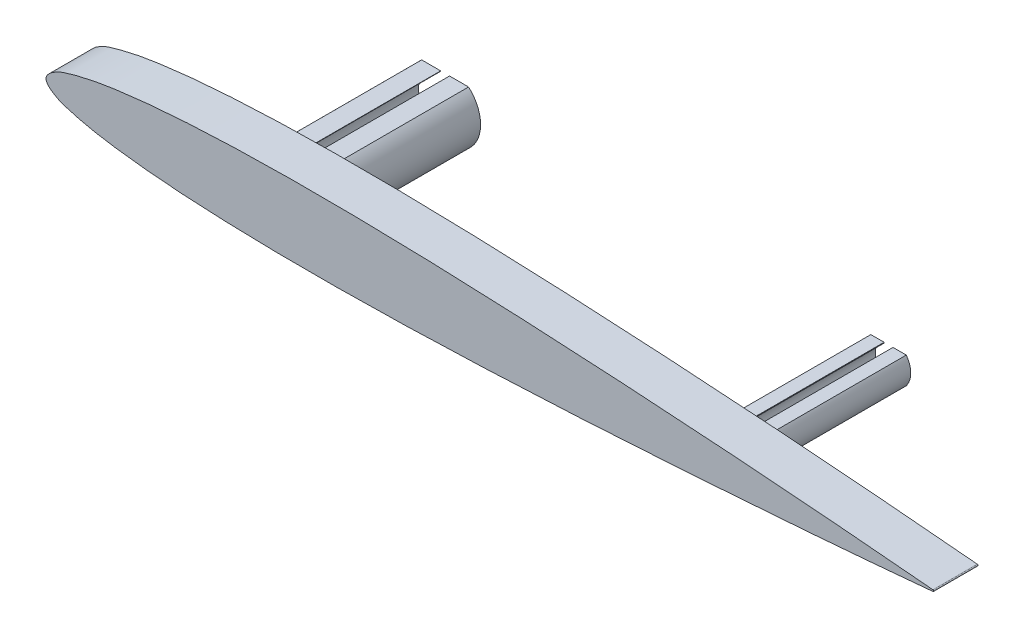
ISO-10303-21;
HEADER;
FILE_DESCRIPTION(('STEP AP214'),'2;1');
FILE_NAME('part.step','',(''),(''),'','','');
FILE_SCHEMA(('AUTOMOTIVE_DESIGN { 1 0 10303 214 1 1 1 1 }'));
ENDSEC;
DATA;
#1=APPLICATION_CONTEXT('core data for automotive mechanical design processes');
#2=APPLICATION_PROTOCOL_DEFINITION('international standard','automotive_design',2000,#1);
#3=PRODUCT_CONTEXT('',#1,'mechanical');
#4=PRODUCT('Part','Part','',(#3));
#5=PRODUCT_RELATED_PRODUCT_CATEGORY('part','',(#4));
#6=PRODUCT_DEFINITION_FORMATION('','',#4);
#7=PRODUCT_DEFINITION_CONTEXT('part definition',#1,'design');
#8=PRODUCT_DEFINITION('design','',#6,#7);
#9=PRODUCT_DEFINITION_SHAPE('','',#8);
#10=(LENGTH_UNIT() NAMED_UNIT(*) SI_UNIT(.MILLI.,.METRE.));
#11=(NAMED_UNIT(*) PLANE_ANGLE_UNIT() SI_UNIT($,.RADIAN.));
#12=(NAMED_UNIT(*) SI_UNIT($,.STERADIAN.) SOLID_ANGLE_UNIT());
#13=UNCERTAINTY_MEASURE_WITH_UNIT(LENGTH_MEASURE(1.E-05),#10,'distance_accuracy_value','');
#14=(GEOMETRIC_REPRESENTATION_CONTEXT(3) GLOBAL_UNCERTAINTY_ASSIGNED_CONTEXT((#13)) GLOBAL_UNIT_ASSIGNED_CONTEXT((#10,
#11,#12)) REPRESENTATION_CONTEXT('',''));
#15=CARTESIAN_POINT('',(0.,0.,0.));
#16=DIRECTION('',(0.,0.,1.));
#17=DIRECTION('',(1.,0.,0.));
#18=AXIS2_PLACEMENT_3D('',#15,#16,#17);
#19=CARTESIAN_POINT('',(0.,0.,0.));
#20=DIRECTION('',(0.,0.,-1.));
#21=DIRECTION('',(-1.,0.,0.));
#22=AXIS2_PLACEMENT_3D('',#19,#20,#21);
#23=PLANE('',#22);
#24=CARTESIAN_POINT('',(25.,0.,0.));
#25=DIRECTION('',(0.,0.,1.));
#26=DIRECTION('',(1.,0.,0.));
#27=AXIS2_PLACEMENT_3D('',#24,#25,#26);
#28=CIRCLE('',#27,4.);
#29=CARTESIAN_POINT('',(27.6457513110646,-3.,0.));
#30=VERTEX_POINT('',#29);
#31=CARTESIAN_POINT('',(27.6457513110646,3.,0.));
#32=VERTEX_POINT('',#31);
#33=EDGE_CURVE('E242',#30,#32,#28,.T.);
#34=ORIENTED_EDGE('',*,*,#33,.T.);
#35=DIRECTION('',(-1.,0.,0.));
#36=VECTOR('',#35,1.);
#37=CARTESIAN_POINT('',(25.5,3.,0.));
#38=LINE('',#37,#36);
#39=CARTESIAN_POINT('',(25.5,3.,0.));
#40=VERTEX_POINT('',#39);
#41=EDGE_CURVE('E211',#32,#40,#38,.T.);
#42=ORIENTED_EDGE('',*,*,#41,.T.);
#43=DIRECTION('',(0.,-1.,0.));
#44=VECTOR('',#43,1.);
#45=CARTESIAN_POINT('',(25.5,2.95803989154981,0.));
#46=LINE('',#45,#44);
#47=CARTESIAN_POINT('',(25.5,2.95803989154981,0.));
#48=VERTEX_POINT('',#47);
#49=EDGE_CURVE('E245',#40,#48,#46,.T.);
#50=ORIENTED_EDGE('',*,*,#49,.T.);
#51=CARTESIAN_POINT('',(25.,0.,0.));
#52=DIRECTION('',(0.,0.,-1.));
#53=DIRECTION('',(1.,0.,0.));
#54=AXIS2_PLACEMENT_3D('',#51,#52,#53);
#55=CIRCLE('',#54,3.);
#56=CARTESIAN_POINT('',(25.5,-2.95803989154981,0.));
#57=VERTEX_POINT('',#56);
#58=EDGE_CURVE('E247',#48,#57,#55,.T.);
#59=ORIENTED_EDGE('',*,*,#58,.T.);
#60=DIRECTION('',(0.,-1.,0.));
#61=VECTOR('',#60,1.);
#62=CARTESIAN_POINT('',(25.5,-3.,0.));
#63=LINE('',#62,#61);
#64=CARTESIAN_POINT('',(25.5,-3.,0.));
#65=VERTEX_POINT('',#64);
#66=EDGE_CURVE('E53',#57,#65,#63,.T.);
#67=ORIENTED_EDGE('',*,*,#66,.T.);
#68=DIRECTION('',(1.,0.,0.));
#69=VECTOR('',#68,1.);
#70=CARTESIAN_POINT('',(25.5,-3.,0.));
#71=LINE('',#70,#69);
#72=EDGE_CURVE('E48',#65,#30,#71,.T.);
#73=ORIENTED_EDGE('',*,*,#72,.T.);
#74=EDGE_LOOP('',(#34,#42,#50,#59,#67,#73));
#75=FACE_BOUND('',#74,.T.);
#76=CARTESIAN_POINT('',(25.,0.,0.));
#77=DIRECTION('',(0.,0.,-1.));
#78=DIRECTION('',(1.,0.,0.));
#79=AXIS2_PLACEMENT_3D('',#76,#77,#78);
#80=CIRCLE('',#79,3.);
#81=CARTESIAN_POINT('',(24.5,-2.95803989154981,0.));
#82=VERTEX_POINT('',#81);
#83=CARTESIAN_POINT('',(24.5,2.95803989154981,0.));
#84=VERTEX_POINT('',#83);
#85=EDGE_CURVE('E251',#82,#84,#80,.T.);
#86=ORIENTED_EDGE('',*,*,#85,.T.);
#87=DIRECTION('',(0.,1.,0.));
#88=VECTOR('',#87,1.);
#89=CARTESIAN_POINT('',(24.5,2.95803989154981,0.));
#90=LINE('',#89,#88);
#91=CARTESIAN_POINT('',(24.5,3.,0.));
#92=VERTEX_POINT('',#91);
#93=EDGE_CURVE('E282',#84,#92,#90,.T.);
#94=ORIENTED_EDGE('',*,*,#93,.T.);
#95=DIRECTION('',(-1.,0.,0.));
#96=VECTOR('',#95,1.);
#97=CARTESIAN_POINT('',(22.3542486889354,3.,0.));
#98=LINE('',#97,#96);
#99=CARTESIAN_POINT('',(22.3542486889354,3.,0.));
#100=VERTEX_POINT('',#99);
#101=EDGE_CURVE('E284',#92,#100,#98,.T.);
#102=ORIENTED_EDGE('',*,*,#101,.T.);
#103=CARTESIAN_POINT('',(25.,0.,0.));
#104=DIRECTION('',(0.,0.,1.));
#105=DIRECTION('',(1.,0.,0.));
#106=AXIS2_PLACEMENT_3D('',#103,#104,#105);
#107=CIRCLE('',#106,4.);
#108=CARTESIAN_POINT('',(22.3542486889354,-3.,0.));
#109=VERTEX_POINT('',#108);
#110=EDGE_CURVE('E286',#100,#109,#107,.T.);
#111=ORIENTED_EDGE('',*,*,#110,.T.);
#112=DIRECTION('',(1.,0.,0.));
#113=VECTOR('',#112,1.);
#114=CARTESIAN_POINT('',(22.3542486889354,-3.,0.));
#115=LINE('',#114,#113);
#116=CARTESIAN_POINT('',(24.5,-3.,0.));
#117=VERTEX_POINT('',#116);
#118=EDGE_CURVE('E288',#109,#117,#115,.T.);
#119=ORIENTED_EDGE('',*,*,#118,.T.);
#120=DIRECTION('',(0.,1.,0.));
#121=VECTOR('',#120,1.);
#122=CARTESIAN_POINT('',(24.5,-3.,0.));
#123=LINE('',#122,#121);
#124=EDGE_CURVE('E265',#117,#82,#123,.T.);
#125=ORIENTED_EDGE('',*,*,#124,.T.);
#126=EDGE_LOOP('',(#86,#94,#102,#111,#119,#125));
#127=FACE_BOUND('',#126,.T.);
#128=CARTESIAN_POINT('',(100.,0.084,0.));
#129=CARTESIAN_POINT('',(98.333488814933,0.236746480055364,0.));
#130=CARTESIAN_POINT('',(95.0011947254255,0.542172688557606,0.));
#131=CARTESIAN_POINT('',(88.3355596211879,1.11089898015662,0.));
#132=CARTESIAN_POINT('',(80.0032933562199,1.76361099520967,0.));
#133=CARTESIAN_POINT('',(70.0029989334555,2.45786169254404,0.));
#134=CARTESIAN_POINT('',(60.0031046254057,3.06174772348002,0.));
#135=CARTESIAN_POINT('',(50.0030086005351,3.55213921170033,0.));
#136=CARTESIAN_POINT('',(40.0025985576922,3.90294649372571,0.));
#137=CARTESIAN_POINT('',(31.666961485844,4.02526015065941,0.));
#138=CARTESIAN_POINT('',(24.9991546003269,3.97693379087482,0.));
#139=CARTESIAN_POINT('',(19.9977755867835,3.84497639830756,0.));
#140=CARTESIAN_POINT('',(14.9933631314586,3.59248695861782,0.));
#141=CARTESIAN_POINT('',(10.8271840648808,3.23765157891607,0.));
#142=CARTESIAN_POINT('',(7.48905438800269,2.81402136675529,0.));
#143=CARTESIAN_POINT('',(4.99359465012965,2.40367305928858,0.));
#144=CARTESIAN_POINT('',(2.84962633983361,1.86792549429032,0.));
#145=CARTESIAN_POINT('',(1.16541350274339,1.32098725183071,0.));
#146=CARTESIAN_POINT('',(-0.664613784127027,0.,0.));
#147=CARTESIAN_POINT('',(1.16541350274339,-1.32098725183071,0.));
#148=CARTESIAN_POINT('',(2.84962633983362,-1.86792549429032,0.));
#149=CARTESIAN_POINT('',(4.99359465012963,-2.40367305928857,0.));
#150=CARTESIAN_POINT('',(7.48905438800269,-2.81402136675529,0.));
#151=CARTESIAN_POINT('',(10.8271840648809,-3.23765157891607,0.));
#152=CARTESIAN_POINT('',(14.9933631314586,-3.59248695861782,0.));
#153=CARTESIAN_POINT('',(19.9977755867835,-3.84497639830756,0.));
#154=CARTESIAN_POINT('',(24.9991546003269,-3.97693379087482,0.));
#155=CARTESIAN_POINT('',(31.666961485844,-4.02526015065941,0.));
#156=CARTESIAN_POINT('',(40.0025985576922,-3.90294649372571,0.));
#157=CARTESIAN_POINT('',(50.0030086005351,-3.55213921170033,0.));
#158=CARTESIAN_POINT('',(60.0031046254058,-3.06174772348002,0.));
#159=CARTESIAN_POINT('',(70.0029989334555,-2.45786169254404,0.));
#160=CARTESIAN_POINT('',(80.0032933562199,-1.76361099520967,0.));
#161=CARTESIAN_POINT('',(88.3355596211879,-1.11089898015662,0.));
#162=CARTESIAN_POINT('',(95.0011947254255,-0.542172688557605,0.));
#163=CARTESIAN_POINT('',(98.333488814933,-0.236746480055364,0.));
#164=CARTESIAN_POINT('',(100.,-0.084,0.));
#165=B_SPLINE_CURVE_WITH_KNOTS('',3,(#128,#129,#130,#131,#132,#133,#134,#135,#136,#137,#138,
#139,#140,#141,#142,#143,#144,#145,#146,#147,#148,#149,#150,#151,#152,#153,#154,#155,#156,#157,
#158,#159,#160,#161,#162,#163,#164),.UNSPECIFIED.,.F.,.F.,(4,1,1,1,1,1,1,1,1,1,1,1,1,1,1,1,1,1,
1,1,1,1,1,1,1,1,1,1,1,1,1,1,1,1,4),(0.,0.0248762929189861,0.0497417146704998,0.0994434021110951,
0.149112224036195,0.198750974066913,0.248359097492202,0.297937369716024,0.347491327096237,
0.37226694027957,0.39705092368842,0.421859474838904,0.446731345826762,0.459220451479859,
0.471790601601357,0.484560454432956,0.491195112481227,0.5,0.508804887518773,0.515439545567044,
0.528209398398643,0.540779548520141,0.553268654173238,0.578140525161096,0.60294907631158,
0.62773305972043,0.652508672903763,0.702062630283976,0.751640902507798,0.801249025933086,
0.850887775963805,0.900556597888905,0.9502582853295,0.975123707081014,1.),.UNSPECIFIED.);
#166=CARTESIAN_POINT('',(100.,0.084,0.));
#167=VERTEX_POINT('',#166);
#168=CARTESIAN_POINT('',(100.,-0.084,0.));
#169=VERTEX_POINT('',#168);
#170=EDGE_CURVE('E393',#167,#169,#165,.T.);
#171=ORIENTED_EDGE('',*,*,#170,.F.);
#172=CARTESIAN_POINT('',(100.,0.,0.));
#173=DIRECTION('',(0.,0.,1.));
#174=DIRECTION('',(-1.,0.,0.));
#175=AXIS2_PLACEMENT_3D('',#172,#173,#174);
#176=CIRCLE('',#175,0.084);
#177=EDGE_CURVE('E401',#169,#167,#176,.T.);
#178=ORIENTED_EDGE('',*,*,#177,.F.);
#179=EDGE_LOOP('',(#171,#178));
#180=FACE_BOUND('',#179,.T.);
#181=DIRECTION('',(0.,-1.,0.));
#182=VECTOR('',#181,1.);
#183=CARTESIAN_POINT('',(74.5,-1.41421356237309,0.));
#184=LINE('',#183,#182);
#185=CARTESIAN_POINT('',(74.5,-1.41421356237309,0.));
#186=VERTEX_POINT('',#185);
#187=CARTESIAN_POINT('',(74.5,-1.5,0.));
#188=VERTEX_POINT('',#187);
#189=EDGE_CURVE('E369',#186,#188,#184,.T.);
#190=ORIENTED_EDGE('',*,*,#189,.F.);
#191=CARTESIAN_POINT('',(75.,0.,0.));
#192=DIRECTION('',(0.,0.,1.));
#193=DIRECTION('',(-1.,0.,0.));
#194=AXIS2_PLACEMENT_3D('',#191,#192,#193);
#195=CIRCLE('',#194,1.5);
#196=CARTESIAN_POINT('',(74.5,1.41421356237309,0.));
#197=VERTEX_POINT('',#196);
#198=EDGE_CURVE('E351',#197,#186,#195,.T.);
#199=ORIENTED_EDGE('',*,*,#198,.F.);
#200=DIRECTION('',(0.,-1.,0.));
#201=VECTOR('',#200,1.);
#202=CARTESIAN_POINT('',(74.5,1.5,0.));
#203=LINE('',#202,#201);
#204=CARTESIAN_POINT('',(74.5,1.5,0.));
#205=VERTEX_POINT('',#204);
#206=EDGE_CURVE('E356',#205,#197,#203,.T.);
#207=ORIENTED_EDGE('',*,*,#206,.F.);
#208=DIRECTION('',(1.,0.,0.));
#209=VECTOR('',#208,1.);
#210=CARTESIAN_POINT('',(74.5,1.5,0.));
#211=LINE('',#210,#209);
#212=CARTESIAN_POINT('',(73.,1.5,0.));
#213=VERTEX_POINT('',#212);
#214=EDGE_CURVE('E375',#213,#205,#211,.T.);
#215=ORIENTED_EDGE('',*,*,#214,.F.);
#216=CARTESIAN_POINT('',(75.,0.,0.));
#217=DIRECTION('',(0.,0.,-1.));
#218=DIRECTION('',(-1.,0.,0.));
#219=AXIS2_PLACEMENT_3D('',#216,#217,#218);
#220=CIRCLE('',#219,2.5);
#221=CARTESIAN_POINT('',(73.,-1.5,0.));
#222=VERTEX_POINT('',#221);
#223=EDGE_CURVE('E373',#222,#213,#220,.T.);
#224=ORIENTED_EDGE('',*,*,#223,.F.);
#225=DIRECTION('',(-1.,0.,0.));
#226=VECTOR('',#225,1.);
#227=CARTESIAN_POINT('',(74.5,-1.5,0.));
#228=LINE('',#227,#226);
#229=EDGE_CURVE('E371',#188,#222,#228,.T.);
#230=ORIENTED_EDGE('',*,*,#229,.F.);
#231=EDGE_LOOP('',(#190,#199,#207,#215,#224,#230));
#232=FACE_BOUND('',#231,.T.);
#233=DIRECTION('',(1.,0.,0.));
#234=VECTOR('',#233,1.);
#235=CARTESIAN_POINT('',(77.,1.5,0.));
#236=LINE('',#235,#234);
#237=CARTESIAN_POINT('',(75.5,1.5,0.));
#238=VERTEX_POINT('',#237);
#239=CARTESIAN_POINT('',(77.,1.5,0.));
#240=VERTEX_POINT('',#239);
#241=EDGE_CURVE('E326',#238,#240,#236,.T.);
#242=ORIENTED_EDGE('',*,*,#241,.F.);
#243=DIRECTION('',(0.,1.,0.));
#244=VECTOR('',#243,1.);
#245=CARTESIAN_POINT('',(75.5,1.5,0.));
#246=LINE('',#245,#244);
#247=CARTESIAN_POINT('',(75.5,1.41421356237309,0.));
#248=VERTEX_POINT('',#247);
#249=EDGE_CURVE('E294',#248,#238,#246,.T.);
#250=ORIENTED_EDGE('',*,*,#249,.F.);
#251=CARTESIAN_POINT('',(75.,0.,0.));
#252=DIRECTION('',(0.,0.,1.));
#253=DIRECTION('',(-1.,0.,0.));
#254=AXIS2_PLACEMENT_3D('',#251,#252,#253);
#255=CIRCLE('',#254,1.5);
#256=CARTESIAN_POINT('',(75.5,-1.41421356237309,0.));
#257=VERTEX_POINT('',#256);
#258=EDGE_CURVE('E313',#257,#248,#255,.T.);
#259=ORIENTED_EDGE('',*,*,#258,.F.);
#260=DIRECTION('',(0.,1.,0.));
#261=VECTOR('',#260,1.);
#262=CARTESIAN_POINT('',(75.5,-1.41421356237309,0.));
#263=LINE('',#262,#261);
#264=CARTESIAN_POINT('',(75.5,-1.5,0.));
#265=VERTEX_POINT('',#264);
#266=EDGE_CURVE('E332',#265,#257,#263,.T.);
#267=ORIENTED_EDGE('',*,*,#266,.F.);
#268=DIRECTION('',(-1.,0.,0.));
#269=VECTOR('',#268,1.);
#270=CARTESIAN_POINT('',(77.,-1.5,0.));
#271=LINE('',#270,#269);
#272=CARTESIAN_POINT('',(77.,-1.5,0.));
#273=VERTEX_POINT('',#272);
#274=EDGE_CURVE('E330',#273,#265,#271,.T.);
#275=ORIENTED_EDGE('',*,*,#274,.F.);
#276=CARTESIAN_POINT('',(75.,0.,0.));
#277=DIRECTION('',(0.,0.,-1.));
#278=DIRECTION('',(-1.,0.,0.));
#279=AXIS2_PLACEMENT_3D('',#276,#277,#278);
#280=CIRCLE('',#279,2.5);
#281=EDGE_CURVE('E328',#240,#273,#280,.T.);
#282=ORIENTED_EDGE('',*,*,#281,.F.);
#283=EDGE_LOOP('',(#242,#250,#259,#267,#275,#282));
#284=FACE_BOUND('',#283,.T.);
#285=ADVANCED_FACE('F32',(#75,#127,#180,#232,#284),#23,.T.);
#286=CARTESIAN_POINT('',(100.,0.084,5.));
#287=CARTESIAN_POINT('',(98.333488814933,0.236746480055364,5.));
#288=CARTESIAN_POINT('',(95.0011947254255,0.542172688557606,5.));
#289=CARTESIAN_POINT('',(88.3355596211879,1.11089898015662,5.));
#290=CARTESIAN_POINT('',(80.0032933562199,1.76361099520967,5.));
#291=CARTESIAN_POINT('',(70.0029989334555,2.45786169254404,5.));
#292=CARTESIAN_POINT('',(60.0031046254057,3.06174772348002,5.));
#293=CARTESIAN_POINT('',(50.0030086005351,3.55213921170033,5.));
#294=CARTESIAN_POINT('',(40.0025985576922,3.90294649372571,5.));
#295=CARTESIAN_POINT('',(31.666961485844,4.02526015065941,5.));
#296=CARTESIAN_POINT('',(24.9991546003269,3.97693379087482,5.));
#297=CARTESIAN_POINT('',(19.9977755867835,3.84497639830756,5.));
#298=CARTESIAN_POINT('',(14.9933631314586,3.59248695861782,5.));
#299=CARTESIAN_POINT('',(10.8271840648808,3.23765157891607,5.));
#300=CARTESIAN_POINT('',(7.48905438800269,2.81402136675529,5.));
#301=CARTESIAN_POINT('',(4.99359465012965,2.40367305928858,5.));
#302=CARTESIAN_POINT('',(2.84962633983361,1.86792549429032,5.));
#303=CARTESIAN_POINT('',(1.16541350274339,1.32098725183071,5.));
#304=CARTESIAN_POINT('',(-0.664613784127027,0.,5.));
#305=CARTESIAN_POINT('',(1.16541350274339,-1.32098725183071,5.));
#306=CARTESIAN_POINT('',(2.84962633983362,-1.86792549429032,5.));
#307=CARTESIAN_POINT('',(4.99359465012963,-2.40367305928857,5.));
#308=CARTESIAN_POINT('',(7.48905438800269,-2.81402136675529,5.));
#309=CARTESIAN_POINT('',(10.8271840648809,-3.23765157891607,5.));
#310=CARTESIAN_POINT('',(14.9933631314586,-3.59248695861782,5.));
#311=CARTESIAN_POINT('',(19.9977755867835,-3.84497639830756,5.));
#312=CARTESIAN_POINT('',(24.9991546003269,-3.97693379087482,5.));
#313=CARTESIAN_POINT('',(31.666961485844,-4.02526015065941,5.));
#314=CARTESIAN_POINT('',(40.0025985576922,-3.90294649372571,5.));
#315=CARTESIAN_POINT('',(50.0030086005351,-3.55213921170033,5.));
#316=CARTESIAN_POINT('',(60.0031046254058,-3.06174772348002,5.));
#317=CARTESIAN_POINT('',(70.0029989334555,-2.45786169254404,5.));
#318=CARTESIAN_POINT('',(80.0032933562199,-1.76361099520967,5.));
#319=CARTESIAN_POINT('',(88.3355596211879,-1.11089898015662,5.));
#320=CARTESIAN_POINT('',(95.0011947254255,-0.542172688557605,5.));
#321=CARTESIAN_POINT('',(98.333488814933,-0.236746480055364,5.));
#322=CARTESIAN_POINT('',(100.,-0.084,5.));
#323=B_SPLINE_CURVE_WITH_KNOTS('',3,(#286,#287,#288,#289,#290,#291,#292,#293,#294,#295,#296,
#297,#298,#299,#300,#301,#302,#303,#304,#305,#306,#307,#308,#309,#310,#311,#312,#313,#314,#315,
#316,#317,#318,#319,#320,#321,#322),.UNSPECIFIED.,.F.,.F.,(4,1,1,1,1,1,1,1,1,1,1,1,1,1,1,1,1,1,
1,1,1,1,1,1,1,1,1,1,1,1,1,1,1,1,4),(0.,0.0248762929189861,0.0497417146704998,0.0994434021110951,
0.149112224036195,0.198750974066913,0.248359097492202,0.297937369716024,0.347491327096237,
0.37226694027957,0.39705092368842,0.421859474838904,0.446731345826762,0.459220451479859,
0.471790601601357,0.484560454432956,0.491195112481227,0.5,0.508804887518773,0.515439545567044,
0.528209398398643,0.540779548520141,0.553268654173238,0.578140525161096,0.60294907631158,
0.62773305972043,0.652508672903763,0.702062630283976,0.751640902507798,0.801249025933086,
0.850887775963805,0.900556597888905,0.9502582853295,0.975123707081014,1.),.UNSPECIFIED.);
#324=DIRECTION('',(0.,0.,-1.));
#325=VECTOR('',#324,1.);
#326=SURFACE_OF_LINEAR_EXTRUSION('',#323,#325);
#327=ORIENTED_EDGE('',*,*,#170,.T.);
#328=DIRECTION('',(0.,0.,-1.));
#329=VECTOR('',#328,1.);
#330=CARTESIAN_POINT('',(100.,-0.084,5.));
#331=LINE('',#330,#329);
#332=CARTESIAN_POINT('',(100.,-0.084,5.));
#333=VERTEX_POINT('',#332);
#334=EDGE_CURVE('E11',#333,#169,#331,.T.);
#335=ORIENTED_EDGE('',*,*,#334,.F.);
#336=CARTESIAN_POINT('',(100.,0.084,5.));
#337=VERTEX_POINT('',#336);
#338=EDGE_CURVE('E394',#337,#333,#323,.T.);
#339=ORIENTED_EDGE('',*,*,#338,.F.);
#340=DIRECTION('',(0.,0.,-1.));
#341=VECTOR('',#340,1.);
#342=CARTESIAN_POINT('',(100.,0.084,5.));
#343=LINE('',#342,#341);
#344=EDGE_CURVE('E41',#337,#167,#343,.T.);
#345=ORIENTED_EDGE('',*,*,#344,.T.);
#346=EDGE_LOOP('',(#327,#335,#339,#345));
#347=FACE_BOUND('',#346,.T.);
#348=ADVANCED_FACE('F34',(#347),#326,.F.);
#349=CARTESIAN_POINT('',(100.,0.,5.));
#350=DIRECTION('',(0.,0.,-1.));
#351=DIRECTION('',(-1.,0.,0.));
#352=AXIS2_PLACEMENT_3D('',#349,#350,#351);
#353=CYLINDRICAL_SURFACE('',#352,0.084);
#354=ORIENTED_EDGE('',*,*,#177,.T.);
#355=ORIENTED_EDGE('',*,*,#344,.F.);
#356=CARTESIAN_POINT('',(100.,0.,5.));
#357=DIRECTION('',(0.,0.,1.));
#358=DIRECTION('',(-1.,0.,0.));
#359=AXIS2_PLACEMENT_3D('',#356,#357,#358);
#360=CIRCLE('',#359,0.084);
#361=EDGE_CURVE('E400',#333,#337,#360,.T.);
#362=ORIENTED_EDGE('',*,*,#361,.F.);
#363=ORIENTED_EDGE('',*,*,#334,.T.);
#364=EDGE_LOOP('',(#354,#355,#362,#363));
#365=FACE_BOUND('',#364,.T.);
#366=ADVANCED_FACE('F422',(#365),#353,.T.);
#367=CARTESIAN_POINT('',(0.,0.,5.));
#368=DIRECTION('',(0.,0.,-1.));
#369=DIRECTION('',(-1.,0.,0.));
#370=AXIS2_PLACEMENT_3D('',#367,#368,#369);
#371=PLANE('',#370);
#372=ORIENTED_EDGE('',*,*,#338,.T.);
#373=ORIENTED_EDGE('',*,*,#361,.T.);
#374=EDGE_LOOP('',(#372,#373));
#375=FACE_BOUND('',#374,.T.);
#376=ADVANCED_FACE('F424',(#375),#371,.F.);
#377=CARTESIAN_POINT('',(75.,0.,-15.));
#378=DIRECTION('',(0.,0.,1.));
#379=DIRECTION('',(1.,0.,0.));
#380=AXIS2_PLACEMENT_3D('',#377,#378,#379);
#381=CYLINDRICAL_SURFACE('',#380,1.5);
#382=ORIENTED_EDGE('',*,*,#198,.T.);
#383=DIRECTION('',(0.,0.,1.));
#384=VECTOR('',#383,1.);
#385=CARTESIAN_POINT('',(74.5,-1.41421356237309,-15.));
#386=LINE('',#385,#384);
#387=CARTESIAN_POINT('',(74.5,-1.41421356237309,-15.));
#388=VERTEX_POINT('',#387);
#389=EDGE_CURVE('E392',#388,#186,#386,.T.);
#390=ORIENTED_EDGE('',*,*,#389,.F.);
#391=CARTESIAN_POINT('',(75.,0.,-15.));
#392=DIRECTION('',(0.,0.,1.));
#393=DIRECTION('',(-1.,0.,0.));
#394=AXIS2_PLACEMENT_3D('',#391,#392,#393);
#395=CIRCLE('',#394,1.5);
#396=CARTESIAN_POINT('',(74.5,1.41421356237309,-15.));
#397=VERTEX_POINT('',#396);
#398=EDGE_CURVE('E352',#397,#388,#395,.T.);
#399=ORIENTED_EDGE('',*,*,#398,.F.);
#400=DIRECTION('',(0.,0.,1.));
#401=VECTOR('',#400,1.);
#402=CARTESIAN_POINT('',(74.5,1.41421356237309,-15.));
#403=LINE('',#402,#401);
#404=EDGE_CURVE('E366',#397,#197,#403,.T.);
#405=ORIENTED_EDGE('',*,*,#404,.T.);
#406=EDGE_LOOP('',(#382,#390,#399,#405));
#407=FACE_BOUND('',#406,.T.);
#408=ADVANCED_FACE('F426',(#407),#381,.F.);
#409=CARTESIAN_POINT('',(74.5,-1.41421356237309,-15.));
#410=DIRECTION('',(-1.,0.,0.));
#411=DIRECTION('',(0.,0.,1.));
#412=AXIS2_PLACEMENT_3D('',#409,#410,#411);
#413=PLANE('',#412);
#414=ORIENTED_EDGE('',*,*,#189,.T.);
#415=DIRECTION('',(0.,0.,1.));
#416=VECTOR('',#415,1.);
#417=CARTESIAN_POINT('',(74.5,-1.5,-15.));
#418=LINE('',#417,#416);
#419=CARTESIAN_POINT('',(74.5,-1.5,-15.));
#420=VERTEX_POINT('',#419);
#421=EDGE_CURVE('E389',#420,#188,#418,.T.);
#422=ORIENTED_EDGE('',*,*,#421,.F.);
#423=DIRECTION('',(0.,-1.,0.));
#424=VECTOR('',#423,1.);
#425=CARTESIAN_POINT('',(74.5,-1.41421356237309,-15.));
#426=LINE('',#425,#424);
#427=EDGE_CURVE('E355',#388,#420,#426,.T.);
#428=ORIENTED_EDGE('',*,*,#427,.F.);
#429=ORIENTED_EDGE('',*,*,#389,.T.);
#430=EDGE_LOOP('',(#414,#422,#428,#429));
#431=FACE_BOUND('',#430,.T.);
#432=ADVANCED_FACE('F432',(#431),#413,.F.);
#433=CARTESIAN_POINT('',(74.5,-1.5,-15.));
#434=DIRECTION('',(0.,1.,0.));
#435=DIRECTION('',(-1.,0.,0.));
#436=AXIS2_PLACEMENT_3D('',#433,#434,#435);
#437=PLANE('',#436);
#438=ORIENTED_EDGE('',*,*,#229,.T.);
#439=DIRECTION('',(0.,0.,1.));
#440=VECTOR('',#439,1.);
#441=CARTESIAN_POINT('',(73.,-1.5,-15.));
#442=LINE('',#441,#440);
#443=CARTESIAN_POINT('',(73.,-1.5,-15.));
#444=VERTEX_POINT('',#443);
#445=EDGE_CURVE('E386',#444,#222,#442,.T.);
#446=ORIENTED_EDGE('',*,*,#445,.F.);
#447=DIRECTION('',(-1.,0.,0.));
#448=VECTOR('',#447,1.);
#449=CARTESIAN_POINT('',(74.5,-1.5,-15.));
#450=LINE('',#449,#448);
#451=EDGE_CURVE('E358',#420,#444,#450,.T.);
#452=ORIENTED_EDGE('',*,*,#451,.F.);
#453=ORIENTED_EDGE('',*,*,#421,.T.);
#454=EDGE_LOOP('',(#438,#446,#452,#453));
#455=FACE_BOUND('',#454,.T.);
#456=ADVANCED_FACE('F531',(#455),#437,.F.);
#457=CARTESIAN_POINT('',(75.,0.,-15.));
#458=DIRECTION('',(0.,0.,1.));
#459=DIRECTION('',(1.,0.,0.));
#460=AXIS2_PLACEMENT_3D('',#457,#458,#459);
#461=CYLINDRICAL_SURFACE('',#460,2.5);
#462=ORIENTED_EDGE('',*,*,#223,.T.);
#463=DIRECTION('',(0.,0.,1.));
#464=VECTOR('',#463,1.);
#465=CARTESIAN_POINT('',(73.,1.5,-15.));
#466=LINE('',#465,#464);
#467=CARTESIAN_POINT('',(73.,1.5,-15.));
#468=VERTEX_POINT('',#467);
#469=EDGE_CURVE('E383',#468,#213,#466,.T.);
#470=ORIENTED_EDGE('',*,*,#469,.F.);
#471=CARTESIAN_POINT('',(75.,0.,-15.));
#472=DIRECTION('',(0.,0.,-1.));
#473=DIRECTION('',(-1.,0.,0.));
#474=AXIS2_PLACEMENT_3D('',#471,#472,#473);
#475=CIRCLE('',#474,2.5);
#476=EDGE_CURVE('E360',#444,#468,#475,.T.);
#477=ORIENTED_EDGE('',*,*,#476,.F.);
#478=ORIENTED_EDGE('',*,*,#445,.T.);
#479=EDGE_LOOP('',(#462,#470,#477,#478));
#480=FACE_BOUND('',#479,.T.);
#481=ADVANCED_FACE('F527',(#480),#461,.T.);
#482=CARTESIAN_POINT('',(74.5,1.5,-15.));
#483=DIRECTION('',(0.,-1.,0.));
#484=DIRECTION('',(1.,0.,0.));
#485=AXIS2_PLACEMENT_3D('',#482,#483,#484);
#486=PLANE('',#485);
#487=ORIENTED_EDGE('',*,*,#214,.T.);
#488=DIRECTION('',(0.,0.,1.));
#489=VECTOR('',#488,1.);
#490=CARTESIAN_POINT('',(74.5,1.5,-15.));
#491=LINE('',#490,#489);
#492=CARTESIAN_POINT('',(74.5,1.5,-15.));
#493=VERTEX_POINT('',#492);
#494=EDGE_CURVE('E381',#493,#205,#491,.T.);
#495=ORIENTED_EDGE('',*,*,#494,.F.);
#496=DIRECTION('',(1.,0.,0.));
#497=VECTOR('',#496,1.);
#498=CARTESIAN_POINT('',(74.5,1.5,-15.));
#499=LINE('',#498,#497);
#500=EDGE_CURVE('E362',#468,#493,#499,.T.);
#501=ORIENTED_EDGE('',*,*,#500,.F.);
#502=ORIENTED_EDGE('',*,*,#469,.T.);
#503=EDGE_LOOP('',(#487,#495,#501,#502));
#504=FACE_BOUND('',#503,.T.);
#505=ADVANCED_FACE('F523',(#504),#486,.F.);
#506=CARTESIAN_POINT('',(74.5,1.5,-15.));
#507=DIRECTION('',(-1.,0.,0.));
#508=DIRECTION('',(0.,0.,1.));
#509=AXIS2_PLACEMENT_3D('',#506,#507,#508);
#510=PLANE('',#509);
#511=ORIENTED_EDGE('',*,*,#206,.T.);
#512=ORIENTED_EDGE('',*,*,#404,.F.);
#513=DIRECTION('',(0.,-1.,0.));
#514=VECTOR('',#513,1.);
#515=CARTESIAN_POINT('',(74.5,1.5,-15.));
#516=LINE('',#515,#514);
#517=EDGE_CURVE('E364',#493,#397,#516,.T.);
#518=ORIENTED_EDGE('',*,*,#517,.F.);
#519=ORIENTED_EDGE('',*,*,#494,.T.);
#520=EDGE_LOOP('',(#511,#512,#518,#519));
#521=FACE_BOUND('',#520,.T.);
#522=ADVANCED_FACE('F519',(#521),#510,.F.);
#523=CARTESIAN_POINT('',(75.,0.,-15.));
#524=DIRECTION('',(0.,0.,-1.));
#525=DIRECTION('',(-1.,0.,0.));
#526=AXIS2_PLACEMENT_3D('',#523,#524,#525);
#527=PLANE('',#526);
#528=ORIENTED_EDGE('',*,*,#398,.T.);
#529=ORIENTED_EDGE('',*,*,#427,.T.);
#530=ORIENTED_EDGE('',*,*,#451,.T.);
#531=ORIENTED_EDGE('',*,*,#476,.T.);
#532=ORIENTED_EDGE('',*,*,#500,.T.);
#533=ORIENTED_EDGE('',*,*,#517,.T.);
#534=EDGE_LOOP('',(#528,#529,#530,#531,#532,#533));
#535=FACE_BOUND('',#534,.T.);
#536=ADVANCED_FACE('F515',(#535),#527,.T.);
#537=CARTESIAN_POINT('',(75.5,1.5,-15.));
#538=DIRECTION('',(1.,0.,0.));
#539=DIRECTION('',(0.,0.,-1.));
#540=AXIS2_PLACEMENT_3D('',#537,#538,#539);
#541=PLANE('',#540);
#542=ORIENTED_EDGE('',*,*,#249,.T.);
#543=DIRECTION('',(0.,0.,1.));
#544=VECTOR('',#543,1.);
#545=CARTESIAN_POINT('',(75.5,1.5,-15.));
#546=LINE('',#545,#544);
#547=CARTESIAN_POINT('',(75.5,1.5,-15.));
#548=VERTEX_POINT('',#547);
#549=EDGE_CURVE('E349',#548,#238,#546,.T.);
#550=ORIENTED_EDGE('',*,*,#549,.F.);
#551=DIRECTION('',(0.,1.,0.));
#552=VECTOR('',#551,1.);
#553=CARTESIAN_POINT('',(75.5,1.5,-15.));
#554=LINE('',#553,#552);
#555=CARTESIAN_POINT('',(75.5,1.41421356237309,-15.));
#556=VERTEX_POINT('',#555);
#557=EDGE_CURVE('E309',#556,#548,#554,.T.);
#558=ORIENTED_EDGE('',*,*,#557,.F.);
#559=DIRECTION('',(0.,0.,1.));
#560=VECTOR('',#559,1.);
#561=CARTESIAN_POINT('',(75.5,1.41421356237309,-15.));
#562=LINE('',#561,#560);
#563=EDGE_CURVE('E323',#556,#248,#562,.T.);
#564=ORIENTED_EDGE('',*,*,#563,.T.);
#565=EDGE_LOOP('',(#542,#550,#558,#564));
#566=FACE_BOUND('',#565,.T.);
#567=ADVANCED_FACE('F511',(#566),#541,.F.);
#568=CARTESIAN_POINT('',(77.,1.5,-15.));
#569=DIRECTION('',(0.,-1.,0.));
#570=DIRECTION('',(0.,0.,-1.));
#571=AXIS2_PLACEMENT_3D('',#568,#569,#570);
#572=PLANE('',#571);
#573=ORIENTED_EDGE('',*,*,#241,.T.);
#574=DIRECTION('',(0.,0.,1.));
#575=VECTOR('',#574,1.);
#576=CARTESIAN_POINT('',(77.,1.5,-15.));
#577=LINE('',#576,#575);
#578=CARTESIAN_POINT('',(77.,1.5,-15.));
#579=VERTEX_POINT('',#578);
#580=EDGE_CURVE('E346',#579,#240,#577,.T.);
#581=ORIENTED_EDGE('',*,*,#580,.F.);
#582=DIRECTION('',(1.,0.,0.));
#583=VECTOR('',#582,1.);
#584=CARTESIAN_POINT('',(77.,1.5,-15.));
#585=LINE('',#584,#583);
#586=EDGE_CURVE('E312',#548,#579,#585,.T.);
#587=ORIENTED_EDGE('',*,*,#586,.F.);
#588=ORIENTED_EDGE('',*,*,#549,.T.);
#589=EDGE_LOOP('',(#573,#581,#587,#588));
#590=FACE_BOUND('',#589,.T.);
#591=ADVANCED_FACE('F507',(#590),#572,.F.);
#592=CARTESIAN_POINT('',(75.,0.,-15.));
#593=DIRECTION('',(0.,0.,1.));
#594=DIRECTION('',(1.,0.,0.));
#595=AXIS2_PLACEMENT_3D('',#592,#593,#594);
#596=CYLINDRICAL_SURFACE('',#595,2.5);
#597=ORIENTED_EDGE('',*,*,#281,.T.);
#598=DIRECTION('',(0.,0.,1.));
#599=VECTOR('',#598,1.);
#600=CARTESIAN_POINT('',(77.,-1.5,-15.));
#601=LINE('',#600,#599);
#602=CARTESIAN_POINT('',(77.,-1.5,-15.));
#603=VERTEX_POINT('',#602);
#604=EDGE_CURVE('E343',#603,#273,#601,.T.);
#605=ORIENTED_EDGE('',*,*,#604,.F.);
#606=CARTESIAN_POINT('',(75.,0.,-15.));
#607=DIRECTION('',(0.,0.,-1.));
#608=DIRECTION('',(-1.,0.,0.));
#609=AXIS2_PLACEMENT_3D('',#606,#607,#608);
#610=CIRCLE('',#609,2.5);
#611=EDGE_CURVE('E315',#579,#603,#610,.T.);
#612=ORIENTED_EDGE('',*,*,#611,.F.);
#613=ORIENTED_EDGE('',*,*,#580,.T.);
#614=EDGE_LOOP('',(#597,#605,#612,#613));
#615=FACE_BOUND('',#614,.T.);
#616=ADVANCED_FACE('F503',(#615),#596,.T.);
#617=CARTESIAN_POINT('',(77.,-1.5,-15.));
#618=DIRECTION('',(0.,1.,0.));
#619=DIRECTION('',(0.,0.,1.));
#620=AXIS2_PLACEMENT_3D('',#617,#618,#619);
#621=PLANE('',#620);
#622=ORIENTED_EDGE('',*,*,#274,.T.);
#623=DIRECTION('',(0.,0.,1.));
#624=VECTOR('',#623,1.);
#625=CARTESIAN_POINT('',(75.5,-1.5,-15.));
#626=LINE('',#625,#624);
#627=CARTESIAN_POINT('',(75.5,-1.5,-15.));
#628=VERTEX_POINT('',#627);
#629=EDGE_CURVE('E340',#628,#265,#626,.T.);
#630=ORIENTED_EDGE('',*,*,#629,.F.);
#631=DIRECTION('',(-1.,0.,0.));
#632=VECTOR('',#631,1.);
#633=CARTESIAN_POINT('',(77.,-1.5,-15.));
#634=LINE('',#633,#632);
#635=EDGE_CURVE('E317',#603,#628,#634,.T.);
#636=ORIENTED_EDGE('',*,*,#635,.F.);
#637=ORIENTED_EDGE('',*,*,#604,.T.);
#638=EDGE_LOOP('',(#622,#630,#636,#637));
#639=FACE_BOUND('',#638,.T.);
#640=ADVANCED_FACE('F499',(#639),#621,.F.);
#641=CARTESIAN_POINT('',(75.5,-1.41421356237309,-15.));
#642=DIRECTION('',(1.,0.,0.));
#643=DIRECTION('',(0.,0.,-1.));
#644=AXIS2_PLACEMENT_3D('',#641,#642,#643);
#645=PLANE('',#644);
#646=ORIENTED_EDGE('',*,*,#266,.T.);
#647=DIRECTION('',(0.,0.,1.));
#648=VECTOR('',#647,1.);
#649=CARTESIAN_POINT('',(75.5,-1.41421356237309,-15.));
#650=LINE('',#649,#648);
#651=CARTESIAN_POINT('',(75.5,-1.41421356237309,-15.));
#652=VERTEX_POINT('',#651);
#653=EDGE_CURVE('E338',#652,#257,#650,.T.);
#654=ORIENTED_EDGE('',*,*,#653,.F.);
#655=DIRECTION('',(0.,1.,0.));
#656=VECTOR('',#655,1.);
#657=CARTESIAN_POINT('',(75.5,-1.41421356237309,-15.));
#658=LINE('',#657,#656);
#659=EDGE_CURVE('E319',#628,#652,#658,.T.);
#660=ORIENTED_EDGE('',*,*,#659,.F.);
#661=ORIENTED_EDGE('',*,*,#629,.T.);
#662=EDGE_LOOP('',(#646,#654,#660,#661));
#663=FACE_BOUND('',#662,.T.);
#664=ADVANCED_FACE('F495',(#663),#645,.F.);
#665=CARTESIAN_POINT('',(75.,0.,-15.));
#666=DIRECTION('',(0.,0.,1.));
#667=DIRECTION('',(1.,0.,0.));
#668=AXIS2_PLACEMENT_3D('',#665,#666,#667);
#669=CYLINDRICAL_SURFACE('',#668,1.5);
#670=ORIENTED_EDGE('',*,*,#258,.T.);
#671=ORIENTED_EDGE('',*,*,#563,.F.);
#672=CARTESIAN_POINT('',(75.,0.,-15.));
#673=DIRECTION('',(0.,0.,1.));
#674=DIRECTION('',(-1.,0.,0.));
#675=AXIS2_PLACEMENT_3D('',#672,#673,#674);
#676=CIRCLE('',#675,1.5);
#677=EDGE_CURVE('E321',#652,#556,#676,.T.);
#678=ORIENTED_EDGE('',*,*,#677,.F.);
#679=ORIENTED_EDGE('',*,*,#653,.T.);
#680=EDGE_LOOP('',(#670,#671,#678,#679));
#681=FACE_BOUND('',#680,.T.);
#682=ADVANCED_FACE('F491',(#681),#669,.F.);
#683=CARTESIAN_POINT('',(75.,0.,-15.));
#684=DIRECTION('',(0.,0.,-1.));
#685=DIRECTION('',(-1.,0.,0.));
#686=AXIS2_PLACEMENT_3D('',#683,#684,#685);
#687=PLANE('',#686);
#688=ORIENTED_EDGE('',*,*,#557,.T.);
#689=ORIENTED_EDGE('',*,*,#586,.T.);
#690=ORIENTED_EDGE('',*,*,#611,.T.);
#691=ORIENTED_EDGE('',*,*,#635,.T.);
#692=ORIENTED_EDGE('',*,*,#659,.T.);
#693=ORIENTED_EDGE('',*,*,#677,.T.);
#694=EDGE_LOOP('',(#688,#689,#690,#691,#692,#693));
#695=FACE_BOUND('',#694,.T.);
#696=ADVANCED_FACE('F488',(#695),#687,.T.);
#697=CARTESIAN_POINT('',(25.,0.,-15.));
#698=DIRECTION('',(0.,0.,1.));
#699=DIRECTION('',(1.,0.,0.));
#700=AXIS2_PLACEMENT_3D('',#697,#698,#699);
#701=CYLINDRICAL_SURFACE('',#700,3.);
#702=ORIENTED_EDGE('',*,*,#85,.F.);
#703=DIRECTION('',(0.,0.,1.));
#704=VECTOR('',#703,1.);
#705=CARTESIAN_POINT('',(24.5,-2.95803989154981,-15.));
#706=LINE('',#705,#704);
#707=CARTESIAN_POINT('',(24.5,-2.95803989154981,-15.));
#708=VERTEX_POINT('',#707);
#709=EDGE_CURVE('E291',#708,#82,#706,.T.);
#710=ORIENTED_EDGE('',*,*,#709,.F.);
#711=CARTESIAN_POINT('',(25.,0.,-15.));
#712=DIRECTION('',(0.,0.,-1.));
#713=DIRECTION('',(1.,0.,0.));
#714=AXIS2_PLACEMENT_3D('',#711,#712,#713);
#715=CIRCLE('',#714,3.);
#716=CARTESIAN_POINT('',(24.5,2.95803989154981,-15.));
#717=VERTEX_POINT('',#716);
#718=EDGE_CURVE('E261',#708,#717,#715,.T.);
#719=ORIENTED_EDGE('',*,*,#718,.T.);
#720=DIRECTION('',(0.,0.,1.));
#721=VECTOR('',#720,1.);
#722=CARTESIAN_POINT('',(24.5,2.95803989154981,-15.));
#723=LINE('',#722,#721);
#724=EDGE_CURVE('E280',#717,#84,#723,.T.);
#725=ORIENTED_EDGE('',*,*,#724,.T.);
#726=EDGE_LOOP('',(#702,#710,#719,#725));
#727=FACE_BOUND('',#726,.T.);
#728=ADVANCED_FACE('F445',(#727),#701,.F.);
#729=CARTESIAN_POINT('',(24.5,-3.,-15.));
#730=DIRECTION('',(1.,0.,0.));
#731=DIRECTION('',(0.,0.,-1.));
#732=AXIS2_PLACEMENT_3D('',#729,#730,#731);
#733=PLANE('',#732);
#734=ORIENTED_EDGE('',*,*,#124,.F.);
#735=DIRECTION('',(0.,0.,1.));
#736=VECTOR('',#735,1.);
#737=CARTESIAN_POINT('',(24.5,-3.,-15.));
#738=LINE('',#737,#736);
#739=CARTESIAN_POINT('',(24.5,-3.,-15.));
#740=VERTEX_POINT('',#739);
#741=EDGE_CURVE('E295',#740,#117,#738,.T.);
#742=ORIENTED_EDGE('',*,*,#741,.F.);
#743=DIRECTION('',(0.,1.,0.));
#744=VECTOR('',#743,1.);
#745=CARTESIAN_POINT('',(24.5,-3.,-15.));
#746=LINE('',#745,#744);
#747=EDGE_CURVE('E277',#740,#708,#746,.T.);
#748=ORIENTED_EDGE('',*,*,#747,.T.);
#749=ORIENTED_EDGE('',*,*,#709,.T.);
#750=EDGE_LOOP('',(#734,#742,#748,#749));
#751=FACE_BOUND('',#750,.T.);
#752=ADVANCED_FACE('F464',(#751),#733,.T.);
#753=CARTESIAN_POINT('',(22.3542486889354,-3.,-15.));
#754=DIRECTION('',(0.,-1.,0.));
#755=DIRECTION('',(1.,0.,0.));
#756=AXIS2_PLACEMENT_3D('',#753,#754,#755);
#757=PLANE('',#756);
#758=ORIENTED_EDGE('',*,*,#118,.F.);
#759=DIRECTION('',(0.,0.,1.));
#760=VECTOR('',#759,1.);
#761=CARTESIAN_POINT('',(22.3542486889354,-3.,-15.));
#762=LINE('',#761,#760);
#763=CARTESIAN_POINT('',(22.3542486889354,-3.,-15.));
#764=VERTEX_POINT('',#763);
#765=EDGE_CURVE('E298',#764,#109,#762,.T.);
#766=ORIENTED_EDGE('',*,*,#765,.F.);
#767=DIRECTION('',(1.,0.,0.));
#768=VECTOR('',#767,1.);
#769=CARTESIAN_POINT('',(22.3542486889354,-3.,-15.));
#770=LINE('',#769,#768);
#771=EDGE_CURVE('E274',#764,#740,#770,.T.);
#772=ORIENTED_EDGE('',*,*,#771,.T.);
#773=ORIENTED_EDGE('',*,*,#741,.T.);
#774=EDGE_LOOP('',(#758,#766,#772,#773));
#775=FACE_BOUND('',#774,.T.);
#776=ADVANCED_FACE('F461',(#775),#757,.T.);
#777=CARTESIAN_POINT('',(25.,0.,-15.));
#778=DIRECTION('',(0.,0.,1.));
#779=DIRECTION('',(1.,0.,0.));
#780=AXIS2_PLACEMENT_3D('',#777,#778,#779);
#781=CYLINDRICAL_SURFACE('',#780,4.);
#782=ORIENTED_EDGE('',*,*,#110,.F.);
#783=DIRECTION('',(0.,0.,1.));
#784=VECTOR('',#783,1.);
#785=CARTESIAN_POINT('',(22.3542486889354,3.,-15.));
#786=LINE('',#785,#784);
#787=CARTESIAN_POINT('',(22.3542486889354,3.,-15.));
#788=VERTEX_POINT('',#787);
#789=EDGE_CURVE('E301',#788,#100,#786,.T.);
#790=ORIENTED_EDGE('',*,*,#789,.F.);
#791=CARTESIAN_POINT('',(25.,0.,-15.));
#792=DIRECTION('',(0.,0.,1.));
#793=DIRECTION('',(1.,0.,0.));
#794=AXIS2_PLACEMENT_3D('',#791,#792,#793);
#795=CIRCLE('',#794,4.);
#796=EDGE_CURVE('E271',#788,#764,#795,.T.);
#797=ORIENTED_EDGE('',*,*,#796,.T.);
#798=ORIENTED_EDGE('',*,*,#765,.T.);
#799=EDGE_LOOP('',(#782,#790,#797,#798));
#800=FACE_BOUND('',#799,.T.);
#801=ADVANCED_FACE('F457',(#800),#781,.T.);
#802=CARTESIAN_POINT('',(22.3542486889354,3.,-15.));
#803=DIRECTION('',(0.,1.,0.));
#804=DIRECTION('',(-1.,0.,0.));
#805=AXIS2_PLACEMENT_3D('',#802,#803,#804);
#806=PLANE('',#805);
#807=ORIENTED_EDGE('',*,*,#101,.F.);
#808=DIRECTION('',(0.,0.,1.));
#809=VECTOR('',#808,1.);
#810=CARTESIAN_POINT('',(24.5,3.,-15.));
#811=LINE('',#810,#809);
#812=CARTESIAN_POINT('',(24.5,3.,-15.));
#813=VERTEX_POINT('',#812);
#814=EDGE_CURVE('E304',#813,#92,#811,.T.);
#815=ORIENTED_EDGE('',*,*,#814,.F.);
#816=DIRECTION('',(-1.,0.,0.));
#817=VECTOR('',#816,1.);
#818=CARTESIAN_POINT('',(22.3542486889354,3.,-15.));
#819=LINE('',#818,#817);
#820=EDGE_CURVE('E268',#813,#788,#819,.T.);
#821=ORIENTED_EDGE('',*,*,#820,.T.);
#822=ORIENTED_EDGE('',*,*,#789,.T.);
#823=EDGE_LOOP('',(#807,#815,#821,#822));
#824=FACE_BOUND('',#823,.T.);
#825=ADVANCED_FACE('F453',(#824),#806,.T.);
#826=CARTESIAN_POINT('',(24.5,2.95803989154981,-15.));
#827=DIRECTION('',(1.,0.,0.));
#828=DIRECTION('',(0.,0.,-1.));
#829=AXIS2_PLACEMENT_3D('',#826,#827,#828);
#830=PLANE('',#829);
#831=ORIENTED_EDGE('',*,*,#93,.F.);
#832=ORIENTED_EDGE('',*,*,#724,.F.);
#833=DIRECTION('',(0.,1.,0.));
#834=VECTOR('',#833,1.);
#835=CARTESIAN_POINT('',(24.5,2.95803989154981,-15.));
#836=LINE('',#835,#834);
#837=EDGE_CURVE('E264',#717,#813,#836,.T.);
#838=ORIENTED_EDGE('',*,*,#837,.T.);
#839=ORIENTED_EDGE('',*,*,#814,.T.);
#840=EDGE_LOOP('',(#831,#832,#838,#839));
#841=FACE_BOUND('',#840,.T.);
#842=ADVANCED_FACE('F449',(#841),#830,.T.);
#843=CARTESIAN_POINT('',(25.,0.,-15.));
#844=DIRECTION('',(0.,0.,1.));
#845=DIRECTION('',(1.,0.,0.));
#846=AXIS2_PLACEMENT_3D('',#843,#844,#845);
#847=PLANE('',#846);
#848=ORIENTED_EDGE('',*,*,#718,.F.);
#849=ORIENTED_EDGE('',*,*,#747,.F.);
#850=ORIENTED_EDGE('',*,*,#771,.F.);
#851=ORIENTED_EDGE('',*,*,#796,.F.);
#852=ORIENTED_EDGE('',*,*,#820,.F.);
#853=ORIENTED_EDGE('',*,*,#837,.F.);
#854=EDGE_LOOP('',(#848,#849,#850,#851,#852,#853));
#855=FACE_BOUND('',#854,.T.);
#856=ADVANCED_FACE('F466',(#855),#847,.F.);
#857=CARTESIAN_POINT('',(25.,0.,-15.));
#858=DIRECTION('',(0.,0.,1.));
#859=DIRECTION('',(1.,0.,0.));
#860=AXIS2_PLACEMENT_3D('',#857,#858,#859);
#861=CYLINDRICAL_SURFACE('',#860,4.);
#862=ORIENTED_EDGE('',*,*,#33,.F.);
#863=DIRECTION('',(0.,0.,1.));
#864=VECTOR('',#863,1.);
#865=CARTESIAN_POINT('',(27.6457513110646,-3.,-15.));
#866=LINE('',#865,#864);
#867=CARTESIAN_POINT('',(27.6457513110646,-3.,-15.));
#868=VERTEX_POINT('',#867);
#869=EDGE_CURVE('E230',#868,#30,#866,.T.);
#870=ORIENTED_EDGE('',*,*,#869,.F.);
#871=CARTESIAN_POINT('',(25.,0.,-15.));
#872=DIRECTION('',(0.,0.,1.));
#873=DIRECTION('',(1.,0.,0.));
#874=AXIS2_PLACEMENT_3D('',#871,#872,#873);
#875=CIRCLE('',#874,4.);
#876=CARTESIAN_POINT('',(27.6457513110646,3.,-15.));
#877=VERTEX_POINT('',#876);
#878=EDGE_CURVE('E223',#868,#877,#875,.T.);
#879=ORIENTED_EDGE('',*,*,#878,.T.);
#880=DIRECTION('',(0.,0.,1.));
#881=VECTOR('',#880,1.);
#882=CARTESIAN_POINT('',(27.6457513110646,3.,-15.));
#883=LINE('',#882,#881);
#884=EDGE_CURVE('E206',#877,#32,#883,.T.);
#885=ORIENTED_EDGE('',*,*,#884,.T.);
#886=EDGE_LOOP('',(#862,#870,#879,#885));
#887=FACE_BOUND('',#886,.T.);
#888=ADVANCED_FACE('F229',(#887),#861,.T.);
#889=CARTESIAN_POINT('',(25.5,-3.,-15.));
#890=DIRECTION('',(0.,-1.,0.));
#891=DIRECTION('',(1.,0.,0.));
#892=AXIS2_PLACEMENT_3D('',#889,#890,#891);
#893=PLANE('',#892);
#894=ORIENTED_EDGE('',*,*,#72,.F.);
#895=DIRECTION('',(0.,0.,1.));
#896=VECTOR('',#895,1.);
#897=CARTESIAN_POINT('',(25.5,-3.,-15.));
#898=LINE('',#897,#896);
#899=CARTESIAN_POINT('',(25.5,-3.,-15.));
#900=VERTEX_POINT('',#899);
#901=EDGE_CURVE('E252',#900,#65,#898,.T.);
#902=ORIENTED_EDGE('',*,*,#901,.F.);
#903=DIRECTION('',(1.,0.,0.));
#904=VECTOR('',#903,1.);
#905=CARTESIAN_POINT('',(25.5,-3.,-15.));
#906=LINE('',#905,#904);
#907=EDGE_CURVE('E216',#900,#868,#906,.T.);
#908=ORIENTED_EDGE('',*,*,#907,.T.);
#909=ORIENTED_EDGE('',*,*,#869,.T.);
#910=EDGE_LOOP('',(#894,#902,#908,#909));
#911=FACE_BOUND('',#910,.T.);
#912=ADVANCED_FACE('F473',(#911),#893,.T.);
#913=CARTESIAN_POINT('',(25.5,-3.,-15.));
#914=DIRECTION('',(-1.,0.,0.));
#915=DIRECTION('',(0.,0.,1.));
#916=AXIS2_PLACEMENT_3D('',#913,#914,#915);
#917=PLANE('',#916);
#918=ORIENTED_EDGE('',*,*,#66,.F.);
#919=DIRECTION('',(0.,0.,1.));
#920=VECTOR('',#919,1.);
#921=CARTESIAN_POINT('',(25.5,-2.95803989154981,-15.));
#922=LINE('',#921,#920);
#923=CARTESIAN_POINT('',(25.5,-2.95803989154981,-15.));
#924=VERTEX_POINT('',#923);
#925=EDGE_CURVE('E254',#924,#57,#922,.T.);
#926=ORIENTED_EDGE('',*,*,#925,.F.);
#927=DIRECTION('',(0.,-1.,0.));
#928=VECTOR('',#927,1.);
#929=CARTESIAN_POINT('',(25.5,-3.,-15.));
#930=LINE('',#929,#928);
#931=EDGE_CURVE('E238',#924,#900,#930,.T.);
#932=ORIENTED_EDGE('',*,*,#931,.T.);
#933=ORIENTED_EDGE('',*,*,#901,.T.);
#934=EDGE_LOOP('',(#918,#926,#932,#933));
#935=FACE_BOUND('',#934,.T.);
#936=ADVANCED_FACE('F668',(#935),#917,.T.);
#937=CARTESIAN_POINT('',(25.,0.,-15.));
#938=DIRECTION('',(0.,0.,1.));
#939=DIRECTION('',(1.,0.,0.));
#940=AXIS2_PLACEMENT_3D('',#937,#938,#939);
#941=CYLINDRICAL_SURFACE('',#940,3.);
#942=ORIENTED_EDGE('',*,*,#58,.F.);
#943=DIRECTION('',(0.,0.,1.));
#944=VECTOR('',#943,1.);
#945=CARTESIAN_POINT('',(25.5,2.95803989154981,-15.));
#946=LINE('',#945,#944);
#947=CARTESIAN_POINT('',(25.5,2.95803989154981,-15.));
#948=VERTEX_POINT('',#947);
#949=EDGE_CURVE('E257',#948,#48,#946,.T.);
#950=ORIENTED_EDGE('',*,*,#949,.F.);
#951=CARTESIAN_POINT('',(25.,0.,-15.));
#952=DIRECTION('',(0.,0.,-1.));
#953=DIRECTION('',(1.,0.,0.));
#954=AXIS2_PLACEMENT_3D('',#951,#952,#953);
#955=CIRCLE('',#954,3.);
#956=EDGE_CURVE('E235',#948,#924,#955,.T.);
#957=ORIENTED_EDGE('',*,*,#956,.T.);
#958=ORIENTED_EDGE('',*,*,#925,.T.);
#959=EDGE_LOOP('',(#942,#950,#957,#958));
#960=FACE_BOUND('',#959,.T.);
#961=ADVANCED_FACE('F678',(#960),#941,.F.);
#962=CARTESIAN_POINT('',(25.5,2.95803989154981,-15.));
#963=DIRECTION('',(-1.,0.,0.));
#964=DIRECTION('',(0.,-1.,0.));
#965=AXIS2_PLACEMENT_3D('',#962,#963,#964);
#966=PLANE('',#965);
#967=ORIENTED_EDGE('',*,*,#49,.F.);
#968=DIRECTION('',(0.,0.,1.));
#969=VECTOR('',#968,1.);
#970=CARTESIAN_POINT('',(25.5,3.,-15.));
#971=LINE('',#970,#969);
#972=CARTESIAN_POINT('',(25.5,3.,-15.));
#973=VERTEX_POINT('',#972);
#974=EDGE_CURVE('E215',#973,#40,#971,.T.);
#975=ORIENTED_EDGE('',*,*,#974,.F.);
#976=DIRECTION('',(0.,-1.,0.));
#977=VECTOR('',#976,1.);
#978=CARTESIAN_POINT('',(25.5,2.95803989154981,-15.));
#979=LINE('',#978,#977);
#980=EDGE_CURVE('E227',#973,#948,#979,.T.);
#981=ORIENTED_EDGE('',*,*,#980,.T.);
#982=ORIENTED_EDGE('',*,*,#949,.T.);
#983=EDGE_LOOP('',(#967,#975,#981,#982));
#984=FACE_BOUND('',#983,.T.);
#985=ADVANCED_FACE('F688',(#984),#966,.T.);
#986=CARTESIAN_POINT('',(25.5,3.,-15.));
#987=DIRECTION('',(0.,1.,0.));
#988=DIRECTION('',(-1.,0.,0.));
#989=AXIS2_PLACEMENT_3D('',#986,#987,#988);
#990=PLANE('',#989);
#991=ORIENTED_EDGE('',*,*,#41,.F.);
#992=ORIENTED_EDGE('',*,*,#884,.F.);
#993=DIRECTION('',(-1.,0.,0.));
#994=VECTOR('',#993,1.);
#995=CARTESIAN_POINT('',(25.5,3.,-15.));
#996=LINE('',#995,#994);
#997=EDGE_CURVE('E210',#877,#973,#996,.T.);
#998=ORIENTED_EDGE('',*,*,#997,.T.);
#999=ORIENTED_EDGE('',*,*,#974,.T.);
#1000=EDGE_LOOP('',(#991,#992,#998,#999));
#1001=FACE_BOUND('',#1000,.T.);
#1002=ADVANCED_FACE('F208',(#1001),#990,.T.);
#1003=CARTESIAN_POINT('',(25.,0.,-15.));
#1004=DIRECTION('',(0.,0.,1.));
#1005=DIRECTION('',(1.,0.,0.));
#1006=AXIS2_PLACEMENT_3D('',#1003,#1004,#1005);
#1007=PLANE('',#1006);
#1008=ORIENTED_EDGE('',*,*,#878,.F.);
#1009=ORIENTED_EDGE('',*,*,#907,.F.);
#1010=ORIENTED_EDGE('',*,*,#931,.F.);
#1011=ORIENTED_EDGE('',*,*,#956,.F.);
#1012=ORIENTED_EDGE('',*,*,#980,.F.);
#1013=ORIENTED_EDGE('',*,*,#997,.F.);
#1014=EDGE_LOOP('',(#1008,#1009,#1010,#1011,#1012,#1013));
#1015=FACE_BOUND('',#1014,.T.);
#1016=ADVANCED_FACE('F221',(#1015),#1007,.F.);
#1017=CLOSED_SHELL('',(#285,#348,#366,#376,#408,#432,#456,#481,#505,#522,#536,#567,#591,#616,
#640,#664,#682,#696,#728,#752,#776,#801,#825,#842,#856,#888,#912,#936,#961,#985,#1002,#1016));
#1018=MANIFOLD_SOLID_BREP('B2',#1017);
#1019=ADVANCED_BREP_SHAPE_REPRESENTATION('',(#18,#1018),#14);
#1020=SHAPE_DEFINITION_REPRESENTATION(#9,#1019);
ENDSEC;
END-ISO-10303-21;
